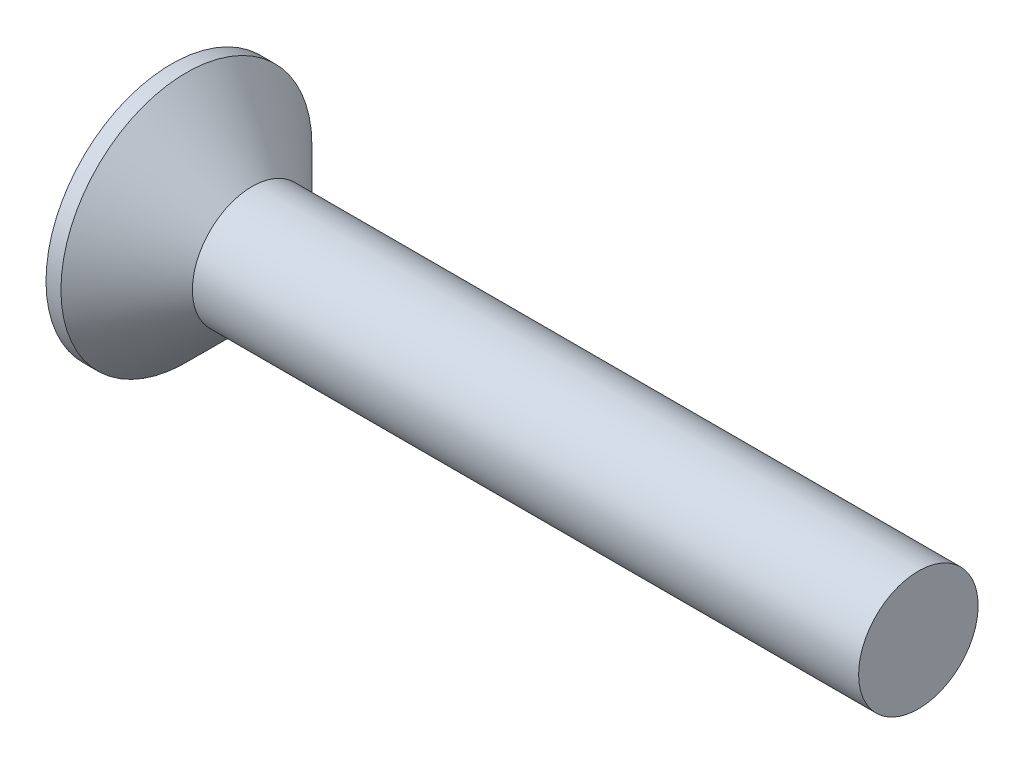
ISO-10303-21;
HEADER;
FILE_DESCRIPTION(('STEP AP214'),'2;1');
FILE_NAME('part.step','',(''),(''),'','','');
FILE_SCHEMA(('AUTOMOTIVE_DESIGN { 1 0 10303 214 1 1 1 1 }'));
ENDSEC;
DATA;
#1=APPLICATION_CONTEXT('core data for automotive mechanical design processes');
#2=APPLICATION_PROTOCOL_DEFINITION('international standard','automotive_design',2000,#1);
#3=PRODUCT_CONTEXT('',#1,'mechanical');
#4=PRODUCT('Part','Part','',(#3));
#5=PRODUCT_RELATED_PRODUCT_CATEGORY('part','',(#4));
#6=PRODUCT_DEFINITION_FORMATION('','',#4);
#7=PRODUCT_DEFINITION_CONTEXT('part definition',#1,'design');
#8=PRODUCT_DEFINITION('design','',#6,#7);
#9=PRODUCT_DEFINITION_SHAPE('','',#8);
#10=(LENGTH_UNIT() NAMED_UNIT(*) SI_UNIT(.MILLI.,.METRE.));
#11=(NAMED_UNIT(*) PLANE_ANGLE_UNIT() SI_UNIT($,.RADIAN.));
#12=(NAMED_UNIT(*) SI_UNIT($,.STERADIAN.) SOLID_ANGLE_UNIT());
#13=UNCERTAINTY_MEASURE_WITH_UNIT(LENGTH_MEASURE(1.E-05),#10,'distance_accuracy_value','');
#14=(GEOMETRIC_REPRESENTATION_CONTEXT(3) GLOBAL_UNCERTAINTY_ASSIGNED_CONTEXT((#13)) GLOBAL_UNIT_ASSIGNED_CONTEXT((#10,
#11,#12)) REPRESENTATION_CONTEXT('',''));
#15=CARTESIAN_POINT('',(0.,0.,0.));
#16=DIRECTION('',(0.,0.,1.));
#17=DIRECTION('',(1.,0.,0.));
#18=AXIS2_PLACEMENT_3D('',#15,#16,#17);
#19=CARTESIAN_POINT('',(-29.5041809668179,19.0724555461864,2.61140936499048));
#20=DIRECTION('',(-1.,0.,0.));
#21=DIRECTION('',(0.,0.,1.));
#22=AXIS2_PLACEMENT_3D('',#19,#20,#21);
#23=PLANE('',#22);
#24=CARTESIAN_POINT('',(-29.5041809668179,19.0724555461864,2.61140936499048));
#25=DIRECTION('',(-1.,0.,0.));
#26=DIRECTION('',(0.,0.,1.));
#27=AXIS2_PLACEMENT_3D('',#24,#25,#26);
#28=CIRCLE('',#27,4.2);
#29=CARTESIAN_POINT('',(-29.5041809668179,19.0724555461864,6.81140936499048));
#30=VERTEX_POINT('',#29);
#31=EDGE_CURVE('E46',#30,#30,#28,.T.);
#32=ORIENTED_EDGE('',*,*,#31,.T.);
#33=EDGE_LOOP('',(#32));
#34=FACE_BOUND('',#33,.T.);
#35=DIRECTION('',(0.,1.,0.));
#36=VECTOR('',#35,1.);
#37=CARTESIAN_POINT('',(-29.5041809668179,16.8424555461864,2.13140936499048));
#38=LINE('',#37,#36);
#39=CARTESIAN_POINT('',(-29.5041809668179,16.8424555461864,2.13140936499048));
#40=VERTEX_POINT('',#39);
#41=CARTESIAN_POINT('',(-29.5041809668179,18.5924555461864,2.13140936499048));
#42=VERTEX_POINT('',#41);
#43=EDGE_CURVE('E107',#40,#42,#38,.T.);
#44=ORIENTED_EDGE('',*,*,#43,.T.);
#45=DIRECTION('',(0.,0.,-1.));
#46=VECTOR('',#45,1.);
#47=CARTESIAN_POINT('',(-29.5041809668179,18.5924555461864,4.84140936499047));
#48=LINE('',#47,#46);
#49=CARTESIAN_POINT('',(-29.5041809668179,18.5924555461864,0.381409364990476));
#50=VERTEX_POINT('',#49);
#51=EDGE_CURVE('E87',#42,#50,#48,.T.);
#52=ORIENTED_EDGE('',*,*,#51,.T.);
#53=DIRECTION('',(0.,1.,0.));
#54=VECTOR('',#53,1.);
#55=CARTESIAN_POINT('',(-29.5041809668179,18.5924555461864,0.381409364990476));
#56=LINE('',#55,#54);
#57=CARTESIAN_POINT('',(-29.5041809668179,19.5524555461864,0.381409364990479));
#58=VERTEX_POINT('',#57);
#59=EDGE_CURVE('E378',#50,#58,#56,.T.);
#60=ORIENTED_EDGE('',*,*,#59,.T.);
#61=DIRECTION('',(0.,0.,1.));
#62=VECTOR('',#61,1.);
#63=CARTESIAN_POINT('',(-29.5041809668179,19.5524555461864,0.381409364990479));
#64=LINE('',#63,#62);
#65=CARTESIAN_POINT('',(-29.5041809668179,19.5524555461864,2.13140936499048));
#66=VERTEX_POINT('',#65);
#67=EDGE_CURVE('E103',#58,#66,#64,.T.);
#68=ORIENTED_EDGE('',*,*,#67,.T.);
#69=CARTESIAN_POINT('',(-29.5041809668179,21.3024555461864,2.13140936499048));
#70=VERTEX_POINT('',#69);
#71=EDGE_CURVE('E97',#66,#70,#38,.T.);
#72=ORIENTED_EDGE('',*,*,#71,.T.);
#73=DIRECTION('',(0.,0.,1.));
#74=VECTOR('',#73,1.);
#75=CARTESIAN_POINT('',(-29.5041809668179,21.3024555461864,2.13140936499048));
#76=LINE('',#75,#74);
#77=CARTESIAN_POINT('',(-29.5041809668179,21.3024555461864,3.09140936499048));
#78=VERTEX_POINT('',#77);
#79=EDGE_CURVE('E100',#70,#78,#76,.T.);
#80=ORIENTED_EDGE('',*,*,#79,.T.);
#81=DIRECTION('',(0.,-1.,0.));
#82=VECTOR('',#81,1.);
#83=CARTESIAN_POINT('',(-29.5041809668179,21.3024555461864,3.09140936499048));
#84=LINE('',#83,#82);
#85=CARTESIAN_POINT('',(-29.5041809668179,19.5524555461864,3.09140936499048));
#86=VERTEX_POINT('',#85);
#87=EDGE_CURVE('E390',#78,#86,#84,.T.);
#88=ORIENTED_EDGE('',*,*,#87,.T.);
#89=CARTESIAN_POINT('',(-29.5041809668179,19.5524555461864,4.84140936499048));
#90=VERTEX_POINT('',#89);
#91=EDGE_CURVE('E373',#86,#90,#64,.T.);
#92=ORIENTED_EDGE('',*,*,#91,.T.);
#93=DIRECTION('',(0.,-1.,0.));
#94=VECTOR('',#93,1.);
#95=CARTESIAN_POINT('',(-29.5041809668179,19.5524555461864,4.84140936499048));
#96=LINE('',#95,#94);
#97=CARTESIAN_POINT('',(-29.5041809668179,18.5924555461864,4.84140936499047));
#98=VERTEX_POINT('',#97);
#99=EDGE_CURVE('E359',#90,#98,#96,.T.);
#100=ORIENTED_EDGE('',*,*,#99,.T.);
#101=CARTESIAN_POINT('',(-29.5041809668179,18.5924555461864,3.09140936499048));
#102=VERTEX_POINT('',#101);
#103=EDGE_CURVE('E371',#98,#102,#48,.T.);
#104=ORIENTED_EDGE('',*,*,#103,.T.);
#105=CARTESIAN_POINT('',(-29.5041809668179,16.8424555461864,3.09140936499048));
#106=VERTEX_POINT('',#105);
#107=EDGE_CURVE('E113',#102,#106,#84,.T.);
#108=ORIENTED_EDGE('',*,*,#107,.T.);
#109=DIRECTION('',(0.,0.,-1.));
#110=VECTOR('',#109,1.);
#111=CARTESIAN_POINT('',(-29.5041809668179,16.8424555461864,3.09140936499048));
#112=LINE('',#111,#110);
#113=EDGE_CURVE('E136',#106,#40,#112,.T.);
#114=ORIENTED_EDGE('',*,*,#113,.T.);
#115=EDGE_LOOP('',(#44,#52,#60,#68,#72,#80,#88,#92,#100,#104,#108,#114));
#116=FACE_BOUND('',#115,.T.);
#117=ADVANCED_FACE('F39',(#34,#116),#23,.T.);
#118=CARTESIAN_POINT('',(-26.5345829768681,19.0724555461864,2.82246464137239));
#119=DIRECTION('',(-0.0901968863789278,0.,-0.995923953767328));
#120=DIRECTION('',(-0.995923953767328,0.,0.0901968863789278));
#121=AXIS2_PLACEMENT_3D('',#118,#119,#120);
#122=PLANE('',#121);
#123=ORIENTED_EDGE('',*,*,#107,.F.);
#124=DIRECTION('',(0.991897347093265,0.0898322125669375,-0.0898322125669372));
#125=VECTOR('',#124,1.);
#126=CARTESIAN_POINT('',(-26.5157770371706,18.8631034492488,2.82076146192808));
#127=LINE('',#126,#125);
#128=CARTESIAN_POINT('',(-26.8541809668179,18.8324555461864,2.85140936499048));
#129=VERTEX_POINT('',#128);
#130=EDGE_CURVE('E131',#102,#129,#127,.T.);
#131=ORIENTED_EDGE('',*,*,#130,.T.);
#132=DIRECTION('',(0.797549052549738,0.59891419417886,-0.0722308575894103));
#133=VECTOR('',#132,1.);
#134=CARTESIAN_POINT('',(-29.5041809668179,16.8424555461864,3.09140936499048));
#135=LINE('',#134,#133);
#136=EDGE_CURVE('E108',#106,#129,#135,.T.);
#137=ORIENTED_EDGE('',*,*,#136,.F.);
#138=EDGE_LOOP('',(#123,#131,#137));
#139=FACE_BOUND('',#138,.T.);
#140=ADVANCED_FACE('F159',(#139),#122,.T.);
#141=DIRECTION('',(0.797549052549738,-0.59891419417886,-0.0722308575894102));
#142=VECTOR('',#141,1.);
#143=CARTESIAN_POINT('',(-29.5041809668179,21.3024555461864,3.09140936499048));
#144=LINE('',#143,#142);
#145=CARTESIAN_POINT('',(-26.8541809668179,19.3124555461864,2.85140936499048));
#146=VERTEX_POINT('',#145);
#147=EDGE_CURVE('E53',#78,#146,#144,.T.);
#148=ORIENTED_EDGE('',*,*,#147,.T.);
#149=DIRECTION('',(-0.991897347093265,0.0898322125669368,0.0898322125669372));
#150=VECTOR('',#149,1.);
#151=CARTESIAN_POINT('',(-26.5157770371706,19.281807643124,2.82076146192808));
#152=LINE('',#151,#150);
#153=EDGE_CURVE('E386',#146,#86,#152,.T.);
#154=ORIENTED_EDGE('',*,*,#153,.T.);
#155=ORIENTED_EDGE('',*,*,#87,.F.);
#156=EDGE_LOOP('',(#148,#154,#155));
#157=FACE_BOUND('',#156,.T.);
#158=ADVANCED_FACE('F163',(#157),#122,.T.);
#159=CARTESIAN_POINT('',(-26.5345829768681,19.0724555461864,2.40035408860857));
#160=DIRECTION('',(-0.0901968863789277,0.,0.995923953767328));
#161=DIRECTION('',(0.995923953767328,0.,0.0901968863789277));
#162=AXIS2_PLACEMENT_3D('',#159,#160,#161);
#163=PLANE('',#162);
#164=DIRECTION('',(0.797549052549738,0.59891419417886,0.0722308575894102));
#165=VECTOR('',#164,1.);
#166=CARTESIAN_POINT('',(-29.5041809668179,16.8424555461864,2.13140936499048));
#167=LINE('',#166,#165);
#168=CARTESIAN_POINT('',(-26.8541809668179,18.8324555461864,2.37140936499048));
#169=VERTEX_POINT('',#168);
#170=EDGE_CURVE('E62',#40,#169,#167,.T.);
#171=ORIENTED_EDGE('',*,*,#170,.T.);
#172=DIRECTION('',(-0.991897347093265,-0.0898322125669369,-0.0898322125669372));
#173=VECTOR('',#172,1.);
#174=CARTESIAN_POINT('',(-26.5157770371706,18.8631034492488,2.40205726805287));
#175=LINE('',#174,#173);
#176=EDGE_CURVE('E11',#169,#42,#175,.T.);
#177=ORIENTED_EDGE('',*,*,#176,.T.);
#178=ORIENTED_EDGE('',*,*,#43,.F.);
#179=EDGE_LOOP('',(#171,#177,#178));
#180=FACE_BOUND('',#179,.T.);
#181=ADVANCED_FACE('F156',(#180),#163,.T.);
#182=ORIENTED_EDGE('',*,*,#71,.F.);
#183=DIRECTION('',(0.991897347093265,-0.0898322125669375,0.0898322125669371));
#184=VECTOR('',#183,1.);
#185=CARTESIAN_POINT('',(-26.5157770371706,19.281807643124,2.40205726805287));
#186=LINE('',#185,#184);
#187=CARTESIAN_POINT('',(-26.8541809668179,19.3124555461864,2.37140936499048));
#188=VERTEX_POINT('',#187);
#189=EDGE_CURVE('E116',#66,#188,#186,.T.);
#190=ORIENTED_EDGE('',*,*,#189,.T.);
#191=DIRECTION('',(0.797549052549738,-0.59891419417886,0.0722308575894102));
#192=VECTOR('',#191,1.);
#193=CARTESIAN_POINT('',(-29.5041809668179,21.3024555461864,2.13140936499048));
#194=LINE('',#193,#192);
#195=EDGE_CURVE('E112',#70,#188,#194,.T.);
#196=ORIENTED_EDGE('',*,*,#195,.F.);
#197=EDGE_LOOP('',(#182,#190,#196));
#198=FACE_BOUND('',#197,.T.);
#199=ADVANCED_FACE('F115',(#198),#163,.T.);
#200=CARTESIAN_POINT('',(-35.8541809668179,19.0724555461864,2.61140936499048));
#201=DIRECTION('',(-1.,0.,0.));
#202=DIRECTION('',(0.,0.,1.));
#203=AXIS2_PLACEMENT_3D('',#200,#201,#202);
#204=CYLINDRICAL_SURFACE('',#203,4.2);
#205=CARTESIAN_POINT('',(-29.0041809668179,19.0724555461864,2.61140936499048));
#206=DIRECTION('',(-1.,0.,0.));
#207=DIRECTION('',(0.,0.,1.));
#208=AXIS2_PLACEMENT_3D('',#205,#206,#207);
#209=CIRCLE('',#208,4.2);
#210=CARTESIAN_POINT('',(-29.0041809668179,19.0724555461864,6.81140936499048));
#211=VERTEX_POINT('',#210);
#212=EDGE_CURVE('E139',#211,#211,#209,.T.);
#213=ORIENTED_EDGE('',*,*,#212,.T.);
#214=EDGE_LOOP('',(#213));
#215=FACE_BOUND('',#214,.T.);
#216=ORIENTED_EDGE('',*,*,#31,.F.);
#217=EDGE_LOOP('',(#216));
#218=FACE_BOUND('',#217,.T.);
#219=ADVANCED_FACE('F145',(#215,#218),#204,.T.);
#220=CARTESIAN_POINT('',(-29.0041809668179,19.0724555461864,2.61140936499048));
#221=DIRECTION('',(-1.,0.,0.));
#222=DIRECTION('',(0.,0.,1.));
#223=AXIS2_PLACEMENT_3D('',#220,#221,#222);
#224=CONICAL_SURFACE('',#223,4.2,0.78539816339745);
#225=CARTESIAN_POINT('',(-26.8041809668179,19.0724555461864,2.61140936499048));
#226=DIRECTION('',(-1.,0.,0.));
#227=DIRECTION('',(0.,0.,1.));
#228=AXIS2_PLACEMENT_3D('',#225,#226,#227);
#229=CIRCLE('',#228,2.);
#230=CARTESIAN_POINT('',(-26.8041809668179,19.0724555461864,4.61140936499048));
#231=VERTEX_POINT('',#230);
#232=EDGE_CURVE('E135',#231,#231,#229,.T.);
#233=ORIENTED_EDGE('',*,*,#232,.T.);
#234=EDGE_LOOP('',(#233));
#235=FACE_BOUND('',#234,.T.);
#236=ORIENTED_EDGE('',*,*,#212,.F.);
#237=EDGE_LOOP('',(#236));
#238=FACE_BOUND('',#237,.T.);
#239=ADVANCED_FACE('F147',(#235,#238),#224,.T.);
#240=CARTESIAN_POINT('',(-35.8541809668179,19.0724555461864,2.61140936499048));
#241=DIRECTION('',(-1.,0.,0.));
#242=DIRECTION('',(0.,0.,1.));
#243=AXIS2_PLACEMENT_3D('',#240,#241,#242);
#244=CYLINDRICAL_SURFACE('',#243,2.);
#245=CARTESIAN_POINT('',(-4.50418096681787,19.0724555461864,2.61140936499048));
#246=DIRECTION('',(-1.,0.,0.));
#247=DIRECTION('',(0.,0.,1.));
#248=AXIS2_PLACEMENT_3D('',#245,#246,#247);
#249=CIRCLE('',#248,2.);
#250=CARTESIAN_POINT('',(-4.50418096681787,19.0724555461864,4.61140936499048));
#251=VERTEX_POINT('',#250);
#252=EDGE_CURVE('E132',#251,#251,#249,.T.);
#253=ORIENTED_EDGE('',*,*,#252,.T.);
#254=EDGE_LOOP('',(#253));
#255=FACE_BOUND('',#254,.T.);
#256=ORIENTED_EDGE('',*,*,#232,.F.);
#257=EDGE_LOOP('',(#256));
#258=FACE_BOUND('',#257,.T.);
#259=ADVANCED_FACE('F153',(#255,#258),#244,.T.);
#260=CARTESIAN_POINT('',(-4.50418096681787,21.0724555461864,2.61140936499048));
#261=DIRECTION('',(1.,0.,0.));
#262=DIRECTION('',(0.,0.,-1.));
#263=AXIS2_PLACEMENT_3D('',#260,#261,#262);
#264=PLANE('',#263);
#265=ORIENTED_EDGE('',*,*,#252,.F.);
#266=EDGE_LOOP('',(#265));
#267=FACE_BOUND('',#266,.T.);
#268=ADVANCED_FACE('F183',(#267),#264,.T.);
#269=CARTESIAN_POINT('',(-26.8541809668179,19.3124555461864,2.37140936499048));
#270=DIRECTION('',(1.,0.,0.));
#271=DIRECTION('',(0.,0.,-1.));
#272=AXIS2_PLACEMENT_3D('',#269,#270,#271);
#273=PLANE('',#272);
#274=DIRECTION('',(0.,1.,0.));
#275=VECTOR('',#274,1.);
#276=CARTESIAN_POINT('',(-26.8541809668179,18.8324555461864,2.37140936499048));
#277=LINE('',#276,#275);
#278=EDGE_CURVE('E127',#169,#188,#277,.T.);
#279=ORIENTED_EDGE('',*,*,#278,.F.);
#280=DIRECTION('',(0.,0.,-1.));
#281=VECTOR('',#280,1.);
#282=CARTESIAN_POINT('',(-26.8541809668179,18.8324555461864,2.85140936499048));
#283=LINE('',#282,#281);
#284=EDGE_CURVE('E118',#129,#169,#283,.T.);
#285=ORIENTED_EDGE('',*,*,#284,.F.);
#286=DIRECTION('',(0.,-1.,0.));
#287=VECTOR('',#286,1.);
#288=CARTESIAN_POINT('',(-26.8541809668179,19.3124555461864,2.85140936499048));
#289=LINE('',#288,#287);
#290=EDGE_CURVE('E121',#146,#129,#289,.T.);
#291=ORIENTED_EDGE('',*,*,#290,.F.);
#292=DIRECTION('',(0.,0.,1.));
#293=VECTOR('',#292,1.);
#294=CARTESIAN_POINT('',(-26.8541809668179,19.3124555461864,2.37140936499048));
#295=LINE('',#294,#293);
#296=EDGE_CURVE('E125',#188,#146,#295,.T.);
#297=ORIENTED_EDGE('',*,*,#296,.F.);
#298=EDGE_LOOP('',(#279,#285,#291,#297));
#299=FACE_BOUND('',#298,.T.);
#300=ADVANCED_FACE('F180',(#299),#273,.F.);
#301=CARTESIAN_POINT('',(-29.5041809668179,16.8424555461864,2.13140936499048));
#302=DIRECTION('',(-0.600482690889725,0.799637754199885,0.));
#303=DIRECTION('',(-0.799637754199885,-0.600482690889725,0.));
#304=AXIS2_PLACEMENT_3D('',#301,#302,#303);
#305=PLANE('',#304);
#306=ORIENTED_EDGE('',*,*,#170,.F.);
#307=ORIENTED_EDGE('',*,*,#113,.F.);
#308=ORIENTED_EDGE('',*,*,#136,.T.);
#309=ORIENTED_EDGE('',*,*,#284,.T.);
#310=EDGE_LOOP('',(#306,#307,#308,#309));
#311=FACE_BOUND('',#310,.T.);
#312=ADVANCED_FACE('F172',(#311),#305,.T.);
#313=CARTESIAN_POINT('',(-26.8541809668179,19.3124555461864,2.85140936499048));
#314=DIRECTION('',(-0.600482690889725,-0.799637754199885,0.));
#315=DIRECTION('',(0.799637754199885,-0.600482690889725,0.));
#316=AXIS2_PLACEMENT_3D('',#313,#314,#315);
#317=PLANE('',#316);
#318=ORIENTED_EDGE('',*,*,#147,.F.);
#319=ORIENTED_EDGE('',*,*,#79,.F.);
#320=ORIENTED_EDGE('',*,*,#195,.T.);
#321=ORIENTED_EDGE('',*,*,#296,.T.);
#322=EDGE_LOOP('',(#318,#319,#320,#321));
#323=FACE_BOUND('',#322,.T.);
#324=ADVANCED_FACE('F111',(#323),#317,.T.);
#325=CARTESIAN_POINT('',(-26.5345829768681,18.8614002698045,2.61140936499048));
#326=DIRECTION('',(-0.0901968863789278,0.995923953767328,0.));
#327=DIRECTION('',(-0.995923953767328,-0.0901968863789278,0.));
#328=AXIS2_PLACEMENT_3D('',#325,#326,#327);
#329=PLANE('',#328);
#330=DIRECTION('',(0.797549052549738,0.0722308575894082,0.59891419417886));
#331=VECTOR('',#330,1.);
#332=CARTESIAN_POINT('',(-29.5041809668179,18.5924555461864,0.381409364990476));
#333=LINE('',#332,#331);
#334=EDGE_CURVE('E380',#50,#169,#333,.T.);
#335=ORIENTED_EDGE('',*,*,#334,.F.);
#336=ORIENTED_EDGE('',*,*,#51,.F.);
#337=ORIENTED_EDGE('',*,*,#176,.F.);
#338=EDGE_LOOP('',(#335,#336,#337));
#339=FACE_BOUND('',#338,.T.);
#340=ADVANCED_FACE('F179',(#339),#329,.T.);
#341=CARTESIAN_POINT('',(-26.5345829768681,19.2835108225683,2.61140936499048));
#342=DIRECTION('',(-0.0901968863789277,-0.995923953767328,0.));
#343=DIRECTION('',(0.995923953767328,-0.0901968863789277,0.));
#344=AXIS2_PLACEMENT_3D('',#341,#342,#343);
#345=PLANE('',#344);
#346=ORIENTED_EDGE('',*,*,#67,.F.);
#347=DIRECTION('',(0.797549052549738,-0.0722308575894123,0.59891419417886));
#348=VECTOR('',#347,1.);
#349=CARTESIAN_POINT('',(-29.5041809668179,19.5524555461864,0.381409364990479));
#350=LINE('',#349,#348);
#351=EDGE_CURVE('E78',#58,#188,#350,.T.);
#352=ORIENTED_EDGE('',*,*,#351,.T.);
#353=ORIENTED_EDGE('',*,*,#189,.F.);
#354=EDGE_LOOP('',(#346,#352,#353));
#355=FACE_BOUND('',#354,.T.);
#356=ADVANCED_FACE('F222',(#355),#345,.T.);
#357=CARTESIAN_POINT('',(-29.5041809668179,19.5524555461864,0.381409364990479));
#358=DIRECTION('',(-0.600482690889725,0.,0.799637754199885));
#359=DIRECTION('',(-0.799637754199885,0.,-0.600482690889725));
#360=AXIS2_PLACEMENT_3D('',#357,#358,#359);
#361=PLANE('',#360);
#362=ORIENTED_EDGE('',*,*,#351,.F.);
#363=ORIENTED_EDGE('',*,*,#59,.F.);
#364=ORIENTED_EDGE('',*,*,#334,.T.);
#365=ORIENTED_EDGE('',*,*,#278,.T.);
#366=EDGE_LOOP('',(#362,#363,#364,#365));
#367=FACE_BOUND('',#366,.T.);
#368=ADVANCED_FACE('F230',(#367),#361,.T.);
#369=ORIENTED_EDGE('',*,*,#103,.F.);
#370=DIRECTION('',(0.797549052549738,0.0722308575894123,-0.59891419417886));
#371=VECTOR('',#370,1.);
#372=CARTESIAN_POINT('',(-29.5041809668179,18.5924555461864,4.84140936499047));
#373=LINE('',#372,#371);
#374=EDGE_CURVE('E356',#98,#129,#373,.T.);
#375=ORIENTED_EDGE('',*,*,#374,.T.);
#376=ORIENTED_EDGE('',*,*,#130,.F.);
#377=EDGE_LOOP('',(#369,#375,#376));
#378=FACE_BOUND('',#377,.T.);
#379=ADVANCED_FACE('F224',(#378),#329,.T.);
#380=DIRECTION('',(0.797549052549738,-0.0722308575894081,-0.59891419417886));
#381=VECTOR('',#380,1.);
#382=CARTESIAN_POINT('',(-29.5041809668179,19.5524555461864,4.84140936499048));
#383=LINE('',#382,#381);
#384=EDGE_CURVE('E367',#90,#146,#383,.T.);
#385=ORIENTED_EDGE('',*,*,#384,.F.);
#386=ORIENTED_EDGE('',*,*,#91,.F.);
#387=ORIENTED_EDGE('',*,*,#153,.F.);
#388=EDGE_LOOP('',(#385,#386,#387));
#389=FACE_BOUND('',#388,.T.);
#390=ADVANCED_FACE('F232',(#389),#345,.T.);
#391=CARTESIAN_POINT('',(-26.8541809668179,18.8324555461864,2.85140936499048));
#392=DIRECTION('',(-0.600482690889725,0.,-0.799637754199885));
#393=DIRECTION('',(0.799637754199885,0.,-0.600482690889725));
#394=AXIS2_PLACEMENT_3D('',#391,#392,#393);
#395=PLANE('',#394);
#396=ORIENTED_EDGE('',*,*,#374,.F.);
#397=ORIENTED_EDGE('',*,*,#99,.F.);
#398=ORIENTED_EDGE('',*,*,#384,.T.);
#399=ORIENTED_EDGE('',*,*,#290,.T.);
#400=EDGE_LOOP('',(#396,#397,#398,#399));
#401=FACE_BOUND('',#400,.T.);
#402=ADVANCED_FACE('F251',(#401),#395,.T.);
#403=CLOSED_SHELL('',(#117,#140,#158,#181,#199,#219,#239,#259,#268,#300,#312,#324,#340,#356,
#368,#379,#390,#402));
#404=MANIFOLD_SOLID_BREP('B2',#403);
#405=ADVANCED_BREP_SHAPE_REPRESENTATION('',(#18,#404),#14);
#406=SHAPE_DEFINITION_REPRESENTATION(#9,#405);
ENDSEC;
END-ISO-10303-21;
